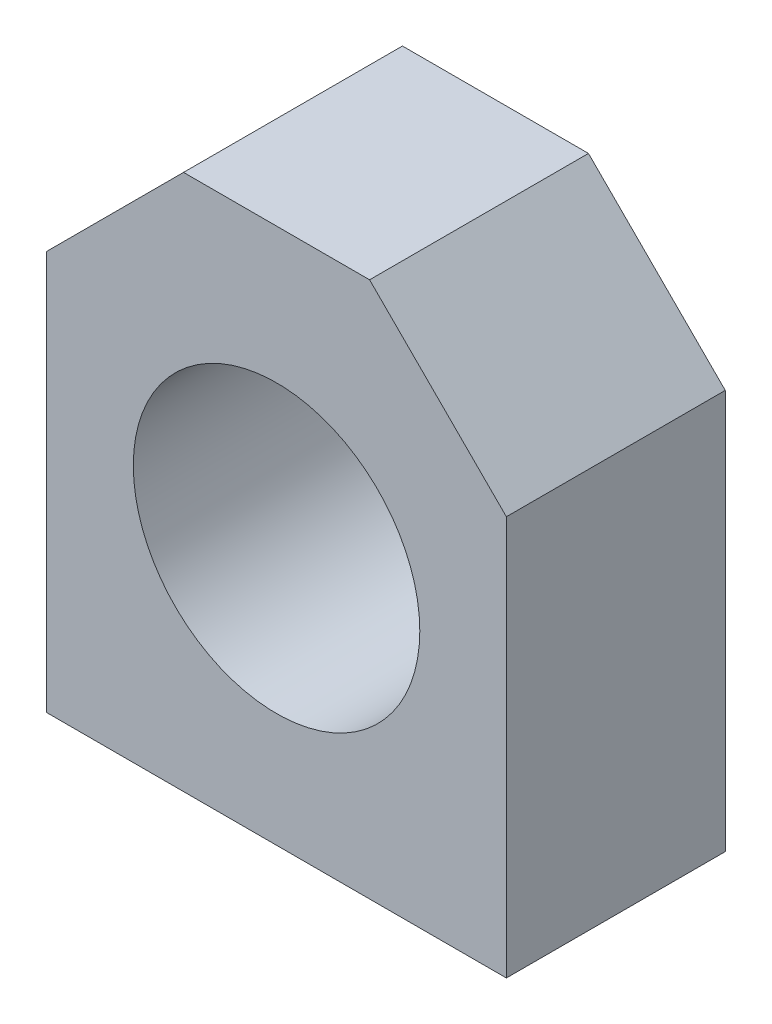
ISO-10303-21;
HEADER;
FILE_DESCRIPTION(('STEP AP214'),'2;1');
FILE_NAME('part.step','',(''),(''),'','','');
FILE_SCHEMA(('AUTOMOTIVE_DESIGN { 1 0 10303 214 1 1 1 1 }'));
ENDSEC;
DATA;
#1=APPLICATION_CONTEXT('core data for automotive mechanical design processes');
#2=APPLICATION_PROTOCOL_DEFINITION('international standard','automotive_design',2000,#1);
#3=PRODUCT_CONTEXT('',#1,'mechanical');
#4=PRODUCT('Part','Part','',(#3));
#5=PRODUCT_RELATED_PRODUCT_CATEGORY('part','',(#4));
#6=PRODUCT_DEFINITION_FORMATION('','',#4);
#7=PRODUCT_DEFINITION_CONTEXT('part definition',#1,'design');
#8=PRODUCT_DEFINITION('design','',#6,#7);
#9=PRODUCT_DEFINITION_SHAPE('','',#8);
#10=(LENGTH_UNIT() NAMED_UNIT(*) SI_UNIT(.MILLI.,.METRE.));
#11=(NAMED_UNIT(*) PLANE_ANGLE_UNIT() SI_UNIT($,.RADIAN.));
#12=(NAMED_UNIT(*) SI_UNIT($,.STERADIAN.) SOLID_ANGLE_UNIT());
#13=UNCERTAINTY_MEASURE_WITH_UNIT(LENGTH_MEASURE(1.E-05),#10,'distance_accuracy_value','');
#14=(GEOMETRIC_REPRESENTATION_CONTEXT(3) GLOBAL_UNCERTAINTY_ASSIGNED_CONTEXT((#13)) GLOBAL_UNIT_ASSIGNED_CONTEXT((#10,
#11,#12)) REPRESENTATION_CONTEXT('',''));
#15=CARTESIAN_POINT('',(0.,0.,0.));
#16=DIRECTION('',(0.,0.,1.));
#17=DIRECTION('',(1.,0.,0.));
#18=AXIS2_PLACEMENT_3D('',#15,#16,#17);
#19=CARTESIAN_POINT('',(4.17085241377354,70.6799179315567,16.1));
#20=DIRECTION('',(0.,0.,1.));
#21=DIRECTION('',(1.,0.,0.));
#22=AXIS2_PLACEMENT_3D('',#19,#20,#21);
#23=CYLINDRICAL_SURFACE('',#22,5.23559775409202);
#24=CARTESIAN_POINT('',(4.17085241377352,70.6799179315567,31.6));
#25=DIRECTION('',(0.,0.,1.));
#26=DIRECTION('',(1.,0.,0.));
#27=AXIS2_PLACEMENT_3D('',#24,#25,#26);
#28=CIRCLE('',#27,5.23559775409202);
#29=CARTESIAN_POINT('',(9.40645016786554,70.6799179315567,31.6));
#30=VERTEX_POINT('',#29);
#31=EDGE_CURVE('E110',#30,#30,#28,.T.);
#32=ORIENTED_EDGE('',*,*,#31,.T.);
#33=EDGE_LOOP('',(#32));
#34=FACE_BOUND('',#33,.T.);
#35=CARTESIAN_POINT('',(4.17085241377353,70.6799179315567,23.6));
#36=DIRECTION('',(0.,0.,-1.));
#37=DIRECTION('',(-1.,0.,0.));
#38=AXIS2_PLACEMENT_3D('',#35,#36,#37);
#39=CIRCLE('',#38,5.23559775409202);
#40=CARTESIAN_POINT('',(-1.06474534031849,70.6799179315567,23.6));
#41=VERTEX_POINT('',#40);
#42=EDGE_CURVE('E146',#41,#41,#39,.T.);
#43=ORIENTED_EDGE('',*,*,#42,.T.);
#44=EDGE_LOOP('',(#43));
#45=FACE_BOUND('',#44,.T.);
#46=ADVANCED_FACE('F16',(#34,#45),#23,.F.);
#47=CARTESIAN_POINT('',(0.770852413773567,80.8752891480924,0.));
#48=DIRECTION('',(-0.707106781186548,0.707106781186547,0.));
#49=DIRECTION('',(0.,0.,1.));
#50=AXIS2_PLACEMENT_3D('',#47,#48,#49);
#51=PLANE('',#50);
#52=DIRECTION('',(0.707106781186547,0.707106781186548,0.));
#53=VECTOR('',#52,1.);
#54=CARTESIAN_POINT('',(2.47085241377356,82.5752891480924,23.6));
#55=LINE('',#54,#53);
#56=CARTESIAN_POINT('',(-4.22914758622644,75.8752891480924,23.6));
#57=VERTEX_POINT('',#56);
#58=CARTESIAN_POINT('',(0.770852413773567,80.8752891480924,23.6));
#59=VERTEX_POINT('',#58);
#60=EDGE_CURVE('E144',#57,#59,#55,.T.);
#61=ORIENTED_EDGE('',*,*,#60,.F.);
#62=DIRECTION('',(0.,0.,-1.));
#63=VECTOR('',#62,1.);
#64=CARTESIAN_POINT('',(-4.22914758622644,75.8752891480924,23.6));
#65=LINE('',#64,#63);
#66=CARTESIAN_POINT('',(-4.22914758622646,75.8752891480924,31.6));
#67=VERTEX_POINT('',#66);
#68=EDGE_CURVE('E120',#67,#57,#65,.T.);
#69=ORIENTED_EDGE('',*,*,#68,.F.);
#70=DIRECTION('',(-0.707106781186547,-0.707106781186548,0.));
#71=VECTOR('',#70,1.);
#72=CARTESIAN_POINT('',(0.770852413773554,80.8752891480924,31.6));
#73=LINE('',#72,#71);
#74=CARTESIAN_POINT('',(0.770852413773567,80.8752891480924,31.6));
#75=VERTEX_POINT('',#74);
#76=EDGE_CURVE('E123',#75,#67,#73,.T.);
#77=ORIENTED_EDGE('',*,*,#76,.F.);
#78=DIRECTION('',(0.,0.,1.));
#79=VECTOR('',#78,1.);
#80=CARTESIAN_POINT('',(0.770852413773567,80.8752891480924,31.6));
#81=LINE('',#80,#79);
#82=EDGE_CURVE('E11',#59,#75,#81,.T.);
#83=ORIENTED_EDGE('',*,*,#82,.F.);
#84=EDGE_LOOP('',(#61,#69,#77,#83));
#85=FACE_BOUND('',#84,.T.);
#86=ADVANCED_FACE('F18',(#85),#51,.T.);
#87=CARTESIAN_POINT('',(12.5708524137736,75.8752891480924,27.6));
#88=DIRECTION('',(-0.707106781186548,-0.707106781186547,0.));
#89=DIRECTION('',(-0.707106781186547,0.707106781186548,0.));
#90=AXIS2_PLACEMENT_3D('',#87,#88,#89);
#91=PLANE('',#90);
#92=DIRECTION('',(0.707106781186547,-0.707106781186548,0.));
#93=VECTOR('',#92,1.);
#94=CARTESIAN_POINT('',(5.87085241377356,82.5752891480924,23.6));
#95=LINE('',#94,#93);
#96=CARTESIAN_POINT('',(7.57085241377357,80.8752891480924,23.6));
#97=VERTEX_POINT('',#96);
#98=CARTESIAN_POINT('',(12.5708524137736,75.8752891480924,23.6));
#99=VERTEX_POINT('',#98);
#100=EDGE_CURVE('E135',#97,#99,#95,.T.);
#101=ORIENTED_EDGE('',*,*,#100,.F.);
#102=DIRECTION('',(0.,0.,-1.));
#103=VECTOR('',#102,1.);
#104=CARTESIAN_POINT('',(7.57085241377357,80.8752891480924,0.));
#105=LINE('',#104,#103);
#106=CARTESIAN_POINT('',(7.57085241377357,80.8752891480924,31.6));
#107=VERTEX_POINT('',#106);
#108=EDGE_CURVE('E25',#107,#97,#105,.T.);
#109=ORIENTED_EDGE('',*,*,#108,.F.);
#110=DIRECTION('',(-0.707106781186547,0.707106781186548,0.));
#111=VECTOR('',#110,1.);
#112=CARTESIAN_POINT('',(12.5708524137736,75.8752891480924,31.6));
#113=LINE('',#112,#111);
#114=CARTESIAN_POINT('',(12.5708524137735,75.8752891480924,31.6));
#115=VERTEX_POINT('',#114);
#116=EDGE_CURVE('E98',#115,#107,#113,.T.);
#117=ORIENTED_EDGE('',*,*,#116,.F.);
#118=DIRECTION('',(0.,0.,1.));
#119=VECTOR('',#118,1.);
#120=CARTESIAN_POINT('',(12.5708524137736,75.8752891480924,27.6));
#121=LINE('',#120,#119);
#122=EDGE_CURVE('E86',#99,#115,#121,.T.);
#123=ORIENTED_EDGE('',*,*,#122,.F.);
#124=EDGE_LOOP('',(#101,#109,#117,#123));
#125=FACE_BOUND('',#124,.T.);
#126=ADVANCED_FACE('F99',(#125),#91,.F.);
#127=CARTESIAN_POINT('',(4.07916753128885,61.2752891480924,0.));
#128=DIRECTION('',(0.,1.,0.));
#129=DIRECTION('',(1.,0.,0.));
#130=AXIS2_PLACEMENT_3D('',#127,#128,#129);
#131=PLANE('',#130);
#132=DIRECTION('',(1.,0.,0.));
#133=VECTOR('',#132,1.);
#134=CARTESIAN_POINT('',(4.17085241377356,61.2752891480924,23.6));
#135=LINE('',#134,#133);
#136=CARTESIAN_POINT('',(-4.22914758622644,61.2752891480924,23.6));
#137=VERTEX_POINT('',#136);
#138=CARTESIAN_POINT('',(12.5708524137736,61.2752891480924,23.6));
#139=VERTEX_POINT('',#138);
#140=EDGE_CURVE('E159',#137,#139,#135,.T.);
#141=ORIENTED_EDGE('',*,*,#140,.T.);
#142=DIRECTION('',(0.,0.,1.));
#143=VECTOR('',#142,1.);
#144=CARTESIAN_POINT('',(12.5708524137736,61.2752891480924,27.6));
#145=LINE('',#144,#143);
#146=CARTESIAN_POINT('',(12.5708524137735,61.2752891480924,31.6));
#147=VERTEX_POINT('',#146);
#148=EDGE_CURVE('E94',#139,#147,#145,.T.);
#149=ORIENTED_EDGE('',*,*,#148,.T.);
#150=DIRECTION('',(1.,0.,0.));
#151=VECTOR('',#150,1.);
#152=CARTESIAN_POINT('',(4.17085241377355,61.2752891480924,31.6));
#153=LINE('',#152,#151);
#154=CARTESIAN_POINT('',(-4.22914758622646,61.2752891480924,31.6));
#155=VERTEX_POINT('',#154);
#156=EDGE_CURVE('E95',#155,#147,#153,.T.);
#157=ORIENTED_EDGE('',*,*,#156,.F.);
#158=DIRECTION('',(0.,0.,1.));
#159=VECTOR('',#158,1.);
#160=CARTESIAN_POINT('',(-4.22914758622644,61.2752891480924,27.6));
#161=LINE('',#160,#159);
#162=EDGE_CURVE('E117',#137,#155,#161,.T.);
#163=ORIENTED_EDGE('',*,*,#162,.F.);
#164=EDGE_LOOP('',(#141,#149,#157,#163));
#165=FACE_BOUND('',#164,.T.);
#166=ADVANCED_FACE('F259',(#165),#131,.F.);
#167=CARTESIAN_POINT('',(4.07916753128885,80.8752891480924,0.));
#168=DIRECTION('',(0.,1.,0.));
#169=DIRECTION('',(1.,0.,0.));
#170=AXIS2_PLACEMENT_3D('',#167,#168,#169);
#171=PLANE('',#170);
#172=DIRECTION('',(1.,0.,0.));
#173=VECTOR('',#172,1.);
#174=CARTESIAN_POINT('',(4.17085241377355,80.8752891480924,31.6));
#175=LINE('',#174,#173);
#176=EDGE_CURVE('E103',#75,#107,#175,.T.);
#177=ORIENTED_EDGE('',*,*,#176,.T.);
#178=ORIENTED_EDGE('',*,*,#108,.T.);
#179=DIRECTION('',(1.,0.,0.));
#180=VECTOR('',#179,1.);
#181=CARTESIAN_POINT('',(4.17085241377356,80.8752891480924,23.6));
#182=LINE('',#181,#180);
#183=EDGE_CURVE('E134',#59,#97,#182,.T.);
#184=ORIENTED_EDGE('',*,*,#183,.F.);
#185=ORIENTED_EDGE('',*,*,#82,.T.);
#186=EDGE_LOOP('',(#177,#178,#184,#185));
#187=FACE_BOUND('',#186,.T.);
#188=ADVANCED_FACE('F132',(#187),#171,.T.);
#189=CARTESIAN_POINT('',(12.5708524137736,80.8752891480924,27.6));
#190=DIRECTION('',(1.,0.,0.));
#191=DIRECTION('',(0.,1.,0.));
#192=AXIS2_PLACEMENT_3D('',#189,#190,#191);
#193=PLANE('',#192);
#194=DIRECTION('',(0.,-1.,0.));
#195=VECTOR('',#194,1.);
#196=CARTESIAN_POINT('',(12.5708524137736,80.8752891480924,23.6));
#197=LINE('',#196,#195);
#198=EDGE_CURVE('E91',#99,#139,#197,.T.);
#199=ORIENTED_EDGE('',*,*,#198,.F.);
#200=ORIENTED_EDGE('',*,*,#122,.T.);
#201=DIRECTION('',(0.,-1.,0.));
#202=VECTOR('',#201,1.);
#203=CARTESIAN_POINT('',(12.5708524137735,80.8752891480924,31.6));
#204=LINE('',#203,#202);
#205=EDGE_CURVE('E89',#115,#147,#204,.T.);
#206=ORIENTED_EDGE('',*,*,#205,.T.);
#207=ORIENTED_EDGE('',*,*,#148,.F.);
#208=EDGE_LOOP('',(#199,#200,#206,#207));
#209=FACE_BOUND('',#208,.T.);
#210=ADVANCED_FACE('F87',(#209),#193,.T.);
#211=CARTESIAN_POINT('',(4.17085241377355,80.8752891480924,31.6));
#212=DIRECTION('',(0.,0.,-1.));
#213=DIRECTION('',(0.,-1.,0.));
#214=AXIS2_PLACEMENT_3D('',#211,#212,#213);
#215=PLANE('',#214);
#216=ORIENTED_EDGE('',*,*,#205,.F.);
#217=ORIENTED_EDGE('',*,*,#116,.T.);
#218=ORIENTED_EDGE('',*,*,#176,.F.);
#219=ORIENTED_EDGE('',*,*,#76,.T.);
#220=DIRECTION('',(0.,-1.,0.));
#221=VECTOR('',#220,1.);
#222=CARTESIAN_POINT('',(-4.22914758622646,80.8752891480924,31.6));
#223=LINE('',#222,#221);
#224=EDGE_CURVE('E167',#67,#155,#223,.T.);
#225=ORIENTED_EDGE('',*,*,#224,.T.);
#226=ORIENTED_EDGE('',*,*,#156,.T.);
#227=EDGE_LOOP('',(#216,#217,#218,#219,#225,#226));
#228=FACE_BOUND('',#227,.T.);
#229=ORIENTED_EDGE('',*,*,#31,.F.);
#230=EDGE_LOOP('',(#229));
#231=FACE_BOUND('',#230,.T.);
#232=ADVANCED_FACE('F106',(#228,#231),#215,.F.);
#233=CARTESIAN_POINT('',(-4.22914758622644,80.8752891480924,27.6));
#234=DIRECTION('',(1.,0.,0.));
#235=DIRECTION('',(0.,1.,0.));
#236=AXIS2_PLACEMENT_3D('',#233,#234,#235);
#237=PLANE('',#236);
#238=ORIENTED_EDGE('',*,*,#224,.F.);
#239=ORIENTED_EDGE('',*,*,#68,.T.);
#240=DIRECTION('',(0.,-1.,0.));
#241=VECTOR('',#240,1.);
#242=CARTESIAN_POINT('',(-4.22914758622644,80.8752891480924,23.6));
#243=LINE('',#242,#241);
#244=EDGE_CURVE('E164',#57,#137,#243,.T.);
#245=ORIENTED_EDGE('',*,*,#244,.T.);
#246=ORIENTED_EDGE('',*,*,#162,.T.);
#247=EDGE_LOOP('',(#238,#239,#245,#246));
#248=FACE_BOUND('',#247,.T.);
#249=ADVANCED_FACE('F229',(#248),#237,.F.);
#250=CARTESIAN_POINT('',(4.17085241377356,80.8752891480924,23.6));
#251=DIRECTION('',(0.,0.,-1.));
#252=DIRECTION('',(0.,-1.,0.));
#253=AXIS2_PLACEMENT_3D('',#250,#251,#252);
#254=PLANE('',#253);
#255=ORIENTED_EDGE('',*,*,#183,.T.);
#256=ORIENTED_EDGE('',*,*,#100,.T.);
#257=ORIENTED_EDGE('',*,*,#198,.T.);
#258=ORIENTED_EDGE('',*,*,#140,.F.);
#259=ORIENTED_EDGE('',*,*,#244,.F.);
#260=ORIENTED_EDGE('',*,*,#60,.T.);
#261=EDGE_LOOP('',(#255,#256,#257,#258,#259,#260));
#262=FACE_BOUND('',#261,.T.);
#263=ORIENTED_EDGE('',*,*,#42,.F.);
#264=EDGE_LOOP('',(#263));
#265=FACE_BOUND('',#264,.T.);
#266=ADVANCED_FACE('F140',(#262,#265),#254,.T.);
#267=CLOSED_SHELL('',(#46,#86,#126,#166,#188,#210,#232,#249,#266));
#268=MANIFOLD_SOLID_BREP('B1',#267);
#269=ADVANCED_BREP_SHAPE_REPRESENTATION('',(#18,#268),#14);
#270=SHAPE_DEFINITION_REPRESENTATION(#9,#269);
ENDSEC;
END-ISO-10303-21;
